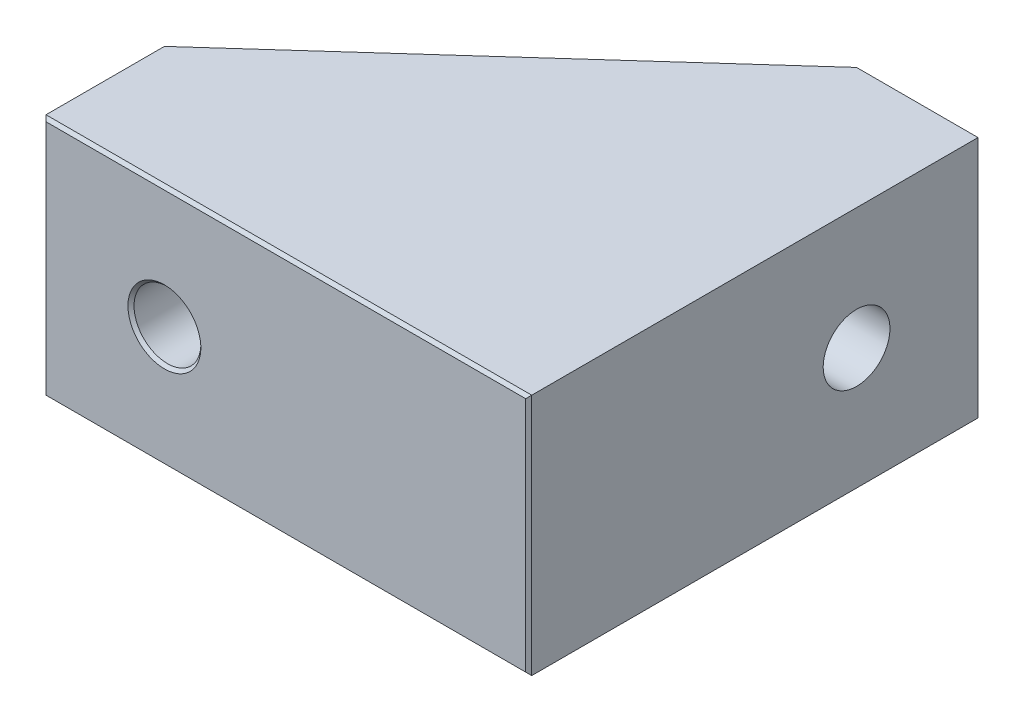
ISO-10303-21;
HEADER;
FILE_DESCRIPTION(('STEP AP214'),'2;1');
FILE_NAME('part.step','',(''),(''),'','','');
FILE_SCHEMA(('AUTOMOTIVE_DESIGN { 1 0 10303 214 1 1 1 1 }'));
ENDSEC;
DATA;
#1=APPLICATION_CONTEXT('core data for automotive mechanical design processes');
#2=APPLICATION_PROTOCOL_DEFINITION('international standard','automotive_design',2000,#1);
#3=PRODUCT_CONTEXT('',#1,'mechanical');
#4=PRODUCT('Part','Part','',(#3));
#5=PRODUCT_RELATED_PRODUCT_CATEGORY('part','',(#4));
#6=PRODUCT_DEFINITION_FORMATION('','',#4);
#7=PRODUCT_DEFINITION_CONTEXT('part definition',#1,'design');
#8=PRODUCT_DEFINITION('design','',#6,#7);
#9=PRODUCT_DEFINITION_SHAPE('','',#8);
#10=(LENGTH_UNIT() NAMED_UNIT(*) SI_UNIT(.MILLI.,.METRE.));
#11=(NAMED_UNIT(*) PLANE_ANGLE_UNIT() SI_UNIT($,.RADIAN.));
#12=(NAMED_UNIT(*) SI_UNIT($,.STERADIAN.) SOLID_ANGLE_UNIT());
#13=UNCERTAINTY_MEASURE_WITH_UNIT(LENGTH_MEASURE(1.E-05),#10,'distance_accuracy_value','');
#14=(GEOMETRIC_REPRESENTATION_CONTEXT(3) GLOBAL_UNCERTAINTY_ASSIGNED_CONTEXT((#13)) GLOBAL_UNIT_ASSIGNED_CONTEXT((#10,
#11,#12)) REPRESENTATION_CONTEXT('',''));
#15=CARTESIAN_POINT('',(0.,0.,0.));
#16=DIRECTION('',(0.,0.,1.));
#17=DIRECTION('',(1.,0.,0.));
#18=AXIS2_PLACEMENT_3D('',#15,#16,#17);
#19=CARTESIAN_POINT('',(-10.,20.,-37.));
#20=DIRECTION('',(1.,0.,0.));
#21=DIRECTION('',(0.,0.,-1.));
#22=AXIS2_PLACEMENT_3D('',#19,#20,#21);
#23=PLANE('',#22);
#24=CARTESIAN_POINT('',(-10.,10.,-27.));
#25=DIRECTION('',(1.,0.,0.));
#26=DIRECTION('',(0.,0.,-1.));
#27=AXIS2_PLACEMENT_3D('',#24,#25,#26);
#28=CIRCLE('',#27,3.00000000000001);
#29=CARTESIAN_POINT('',(-10.,10.,-30.));
#30=VERTEX_POINT('',#29);
#31=EDGE_CURVE('E52',#30,#30,#28,.T.);
#32=ORIENTED_EDGE('',*,*,#31,.T.);
#33=EDGE_LOOP('',(#32));
#34=FACE_BOUND('',#33,.T.);
#35=DIRECTION('',(0.,-1.,0.));
#36=VECTOR('',#35,1.);
#37=CARTESIAN_POINT('',(-9.99999999999999,20.,-10.));
#38=LINE('',#37,#36);
#39=CARTESIAN_POINT('',(-9.99999999999999,15.5,-10.));
#40=VERTEX_POINT('',#39);
#41=CARTESIAN_POINT('',(-9.99999999999999,4.5,-10.));
#42=VERTEX_POINT('',#41);
#43=EDGE_CURVE('E159',#40,#42,#38,.T.);
#44=ORIENTED_EDGE('',*,*,#43,.F.);
#45=DIRECTION('',(0.,0.,-1.));
#46=VECTOR('',#45,1.);
#47=CARTESIAN_POINT('',(-9.99999999999999,15.5,-10.));
#48=LINE('',#47,#46);
#49=CARTESIAN_POINT('',(-10.,15.5,-37.));
#50=VERTEX_POINT('',#49);
#51=EDGE_CURVE('E128',#40,#50,#48,.T.);
#52=ORIENTED_EDGE('',*,*,#51,.T.);
#53=DIRECTION('',(0.,-1.,0.));
#54=VECTOR('',#53,1.);
#55=CARTESIAN_POINT('',(-10.,20.,-37.));
#56=LINE('',#55,#54);
#57=CARTESIAN_POINT('',(-10.,4.5,-37.));
#58=VERTEX_POINT('',#57);
#59=EDGE_CURVE('E161',#50,#58,#56,.T.);
#60=ORIENTED_EDGE('',*,*,#59,.T.);
#61=DIRECTION('',(0.,0.,1.));
#62=VECTOR('',#61,1.);
#63=CARTESIAN_POINT('',(-9.99999999999999,4.5,-10.));
#64=LINE('',#63,#62);
#65=EDGE_CURVE('E241',#58,#42,#64,.T.);
#66=ORIENTED_EDGE('',*,*,#65,.T.);
#67=EDGE_LOOP('',(#44,#52,#60,#66));
#68=FACE_BOUND('',#67,.T.);
#69=ADVANCED_FACE('F41',(#34,#68),#23,.F.);
#70=CARTESIAN_POINT('',(-9.99999999999999,20.,-10.));
#71=DIRECTION('',(0.,0.,1.));
#72=DIRECTION('',(1.,0.,0.));
#73=AXIS2_PLACEMENT_3D('',#70,#71,#72);
#74=PLANE('',#73);
#75=CARTESIAN_POINT('',(-30.,10.,-10.));
#76=DIRECTION('',(0.,0.,1.));
#77=DIRECTION('',(1.,0.,0.));
#78=AXIS2_PLACEMENT_3D('',#75,#76,#77);
#79=CIRCLE('',#78,3.);
#80=CARTESIAN_POINT('',(-27.,10.,-10.));
#81=VERTEX_POINT('',#80);
#82=EDGE_CURVE('E11',#81,#81,#79,.T.);
#83=ORIENTED_EDGE('',*,*,#82,.T.);
#84=EDGE_LOOP('',(#83));
#85=FACE_BOUND('',#84,.T.);
#86=DIRECTION('',(0.,-1.,0.));
#87=VECTOR('',#86,1.);
#88=CARTESIAN_POINT('',(-40.,20.,-10.));
#89=LINE('',#88,#87);
#90=CARTESIAN_POINT('',(-40.,15.5,-10.));
#91=VERTEX_POINT('',#90);
#92=CARTESIAN_POINT('',(-40.,4.5,-10.));
#93=VERTEX_POINT('',#92);
#94=EDGE_CURVE('E146',#91,#93,#89,.T.);
#95=ORIENTED_EDGE('',*,*,#94,.F.);
#96=DIRECTION('',(1.,0.,0.));
#97=VECTOR('',#96,1.);
#98=CARTESIAN_POINT('',(-40.,15.5,-10.));
#99=LINE('',#98,#97);
#100=EDGE_CURVE('E123',#91,#40,#99,.T.);
#101=ORIENTED_EDGE('',*,*,#100,.T.);
#102=ORIENTED_EDGE('',*,*,#43,.T.);
#103=DIRECTION('',(-1.,0.,0.));
#104=VECTOR('',#103,1.);
#105=CARTESIAN_POINT('',(-40.,4.5,-10.));
#106=LINE('',#105,#104);
#107=EDGE_CURVE('E149',#42,#93,#106,.T.);
#108=ORIENTED_EDGE('',*,*,#107,.T.);
#109=EDGE_LOOP('',(#95,#101,#102,#108));
#110=FACE_BOUND('',#109,.T.);
#111=ADVANCED_FACE('F147',(#85,#110),#74,.F.);
#112=CARTESIAN_POINT('',(0.,20.,0.));
#113=DIRECTION('',(-1.,0.,0.));
#114=DIRECTION('',(0.,0.,1.));
#115=AXIS2_PLACEMENT_3D('',#112,#113,#114);
#116=PLANE('',#115);
#117=CARTESIAN_POINT('',(0.,10.,-27.));
#118=DIRECTION('',(-1.,0.,0.));
#119=DIRECTION('',(0.,0.,1.));
#120=AXIS2_PLACEMENT_3D('',#117,#118,#119);
#121=CIRCLE('',#120,2.75);
#122=CARTESIAN_POINT('',(0.,10.,-24.25));
#123=VERTEX_POINT('',#122);
#124=EDGE_CURVE('E255',#123,#123,#121,.T.);
#125=ORIENTED_EDGE('',*,*,#124,.T.);
#126=EDGE_LOOP('',(#125));
#127=FACE_BOUND('',#126,.T.);
#128=DIRECTION('',(0.,0.,-1.));
#129=VECTOR('',#128,1.);
#130=CARTESIAN_POINT('',(0.,20.,0.));
#131=LINE('',#130,#129);
#132=CARTESIAN_POINT('',(0.,20.,-0.25));
#133=VERTEX_POINT('',#132);
#134=CARTESIAN_POINT('',(0.,20.,-37.));
#135=VERTEX_POINT('',#134);
#136=EDGE_CURVE('E263',#133,#135,#131,.T.);
#137=ORIENTED_EDGE('',*,*,#136,.F.);
#138=DIRECTION('',(0.,-1.,0.));
#139=VECTOR('',#138,1.);
#140=CARTESIAN_POINT('',(0.,20.,-0.25));
#141=LINE('',#140,#139);
#142=CARTESIAN_POINT('',(0.,0.,-0.25));
#143=VERTEX_POINT('',#142);
#144=EDGE_CURVE('E60',#133,#143,#141,.T.);
#145=ORIENTED_EDGE('',*,*,#144,.T.);
#146=DIRECTION('',(0.,0.,-1.));
#147=VECTOR('',#146,1.);
#148=CARTESIAN_POINT('',(0.,0.,0.));
#149=LINE('',#148,#147);
#150=CARTESIAN_POINT('',(0.,0.,-37.));
#151=VERTEX_POINT('',#150);
#152=EDGE_CURVE('E262',#143,#151,#149,.T.);
#153=ORIENTED_EDGE('',*,*,#152,.T.);
#154=DIRECTION('',(0.,-1.,0.));
#155=VECTOR('',#154,1.);
#156=CARTESIAN_POINT('',(0.,20.,-37.));
#157=LINE('',#156,#155);
#158=EDGE_CURVE('E169',#135,#151,#157,.T.);
#159=ORIENTED_EDGE('',*,*,#158,.F.);
#160=EDGE_LOOP('',(#137,#145,#153,#159));
#161=FACE_BOUND('',#160,.T.);
#162=ADVANCED_FACE('F310',(#127,#161),#116,.F.);
#163=CARTESIAN_POINT('',(0.,20.,-37.));
#164=DIRECTION('',(0.,0.,1.));
#165=DIRECTION('',(1.,0.,0.));
#166=AXIS2_PLACEMENT_3D('',#163,#164,#165);
#167=PLANE('',#166);
#168=DIRECTION('',(-1.,0.,0.));
#169=VECTOR('',#168,1.);
#170=CARTESIAN_POINT('',(0.,0.,-37.));
#171=LINE('',#170,#169);
#172=CARTESIAN_POINT('',(-10.,0.,-37.));
#173=VERTEX_POINT('',#172);
#174=EDGE_CURVE('E272',#151,#173,#171,.T.);
#175=ORIENTED_EDGE('',*,*,#174,.T.);
#176=DIRECTION('',(0.,-1.,0.));
#177=VECTOR('',#176,1.);
#178=CARTESIAN_POINT('',(-10.,4.5,-37.));
#179=LINE('',#178,#177);
#180=EDGE_CURVE('E248',#58,#173,#179,.T.);
#181=ORIENTED_EDGE('',*,*,#180,.F.);
#182=ORIENTED_EDGE('',*,*,#59,.F.);
#183=CARTESIAN_POINT('',(-10.,20.,-37.));
#184=VERTEX_POINT('',#183);
#185=EDGE_CURVE('E141',#184,#50,#56,.T.);
#186=ORIENTED_EDGE('',*,*,#185,.F.);
#187=DIRECTION('',(-1.,0.,0.));
#188=VECTOR('',#187,1.);
#189=CARTESIAN_POINT('',(0.,20.,-37.));
#190=LINE('',#189,#188);
#191=EDGE_CURVE('E266',#135,#184,#190,.T.);
#192=ORIENTED_EDGE('',*,*,#191,.F.);
#193=ORIENTED_EDGE('',*,*,#158,.T.);
#194=EDGE_LOOP('',(#175,#181,#182,#186,#192,#193));
#195=FACE_BOUND('',#194,.T.);
#196=ADVANCED_FACE('F316',(#195),#167,.F.);
#197=CARTESIAN_POINT('',(-40.,20.,-10.));
#198=DIRECTION('',(1.,0.,0.));
#199=DIRECTION('',(0.,0.,-1.));
#200=AXIS2_PLACEMENT_3D('',#197,#198,#199);
#201=PLANE('',#200);
#202=DIRECTION('',(0.,0.,1.));
#203=VECTOR('',#202,1.);
#204=CARTESIAN_POINT('',(-40.,0.,-10.));
#205=LINE('',#204,#203);
#206=CARTESIAN_POINT('',(-40.,0.,-10.));
#207=VERTEX_POINT('',#206);
#208=CARTESIAN_POINT('',(-40.,0.,-0.25));
#209=VERTEX_POINT('',#208);
#210=EDGE_CURVE('E164',#207,#209,#205,.T.);
#211=ORIENTED_EDGE('',*,*,#210,.T.);
#212=DIRECTION('',(0.,1.,0.));
#213=VECTOR('',#212,1.);
#214=CARTESIAN_POINT('',(-40.,20.,-0.25));
#215=LINE('',#214,#213);
#216=CARTESIAN_POINT('',(-40.,20.,-0.25));
#217=VERTEX_POINT('',#216);
#218=EDGE_CURVE('E190',#209,#217,#215,.T.);
#219=ORIENTED_EDGE('',*,*,#218,.T.);
#220=DIRECTION('',(0.,0.,1.));
#221=VECTOR('',#220,1.);
#222=CARTESIAN_POINT('',(-40.,20.,-10.));
#223=LINE('',#222,#221);
#224=CARTESIAN_POINT('',(-40.,20.,-10.));
#225=VERTEX_POINT('',#224);
#226=EDGE_CURVE('E153',#225,#217,#223,.T.);
#227=ORIENTED_EDGE('',*,*,#226,.F.);
#228=EDGE_CURVE('E138',#225,#91,#89,.T.);
#229=ORIENTED_EDGE('',*,*,#228,.T.);
#230=ORIENTED_EDGE('',*,*,#94,.T.);
#231=DIRECTION('',(0.,-1.,0.));
#232=VECTOR('',#231,1.);
#233=CARTESIAN_POINT('',(-40.,4.5,-10.));
#234=LINE('',#233,#232);
#235=EDGE_CURVE('E252',#93,#207,#234,.T.);
#236=ORIENTED_EDGE('',*,*,#235,.T.);
#237=EDGE_LOOP('',(#211,#219,#227,#229,#230,#236));
#238=FACE_BOUND('',#237,.T.);
#239=ADVANCED_FACE('F156',(#238),#201,.F.);
#240=CARTESIAN_POINT('',(-40.,20.,0.));
#241=DIRECTION('',(0.,0.,-1.));
#242=DIRECTION('',(-1.,0.,0.));
#243=AXIS2_PLACEMENT_3D('',#240,#241,#242);
#244=PLANE('',#243);
#245=DIRECTION('',(-1.,0.,0.));
#246=VECTOR('',#245,1.);
#247=CARTESIAN_POINT('',(-40.,19.75,0.));
#248=LINE('',#247,#246);
#249=CARTESIAN_POINT('',(-0.25,19.75,0.));
#250=VERTEX_POINT('',#249);
#251=CARTESIAN_POINT('',(-39.75,19.75,0.));
#252=VERTEX_POINT('',#251);
#253=EDGE_CURVE('E183',#250,#252,#248,.T.);
#254=ORIENTED_EDGE('',*,*,#253,.T.);
#255=DIRECTION('',(0.,-1.,0.));
#256=VECTOR('',#255,1.);
#257=CARTESIAN_POINT('',(-39.75,20.,0.));
#258=LINE('',#257,#256);
#259=CARTESIAN_POINT('',(-39.75,0.25,0.));
#260=VERTEX_POINT('',#259);
#261=EDGE_CURVE('E186',#252,#260,#258,.T.);
#262=ORIENTED_EDGE('',*,*,#261,.T.);
#263=DIRECTION('',(1.,0.,0.));
#264=VECTOR('',#263,1.);
#265=CARTESIAN_POINT('',(-40.,0.25,0.));
#266=LINE('',#265,#264);
#267=CARTESIAN_POINT('',(-0.25,0.25,0.));
#268=VERTEX_POINT('',#267);
#269=EDGE_CURVE('E177',#260,#268,#266,.T.);
#270=ORIENTED_EDGE('',*,*,#269,.T.);
#271=DIRECTION('',(0.,1.,0.));
#272=VECTOR('',#271,1.);
#273=CARTESIAN_POINT('',(-0.25,20.,0.));
#274=LINE('',#273,#272);
#275=EDGE_CURVE('E180',#268,#250,#274,.T.);
#276=ORIENTED_EDGE('',*,*,#275,.T.);
#277=EDGE_LOOP('',(#254,#262,#270,#276));
#278=FACE_BOUND('',#277,.T.);
#279=CARTESIAN_POINT('',(-30.,10.,0.));
#280=DIRECTION('',(0.,0.,-1.));
#281=DIRECTION('',(-1.,0.,0.));
#282=AXIS2_PLACEMENT_3D('',#279,#280,#281);
#283=CIRCLE('',#282,2.99999999999996);
#284=CARTESIAN_POINT('',(-33.,10.,0.));
#285=VERTEX_POINT('',#284);
#286=EDGE_CURVE('E173',#285,#285,#283,.T.);
#287=ORIENTED_EDGE('',*,*,#286,.T.);
#288=EDGE_LOOP('',(#287));
#289=FACE_BOUND('',#288,.T.);
#290=ADVANCED_FACE('F290',(#278,#289),#244,.F.);
#291=CARTESIAN_POINT('',(0.,20.,0.));
#292=DIRECTION('',(0.,1.,0.));
#293=DIRECTION('',(0.,0.,1.));
#294=AXIS2_PLACEMENT_3D('',#291,#292,#293);
#295=PLANE('',#294);
#296=ORIENTED_EDGE('',*,*,#226,.T.);
#297=DIRECTION('',(1.,0.,0.));
#298=VECTOR('',#297,1.);
#299=CARTESIAN_POINT('',(0.,20.,-0.25));
#300=LINE('',#299,#298);
#301=EDGE_CURVE('E68',#217,#133,#300,.T.);
#302=ORIENTED_EDGE('',*,*,#301,.T.);
#303=ORIENTED_EDGE('',*,*,#136,.T.);
#304=ORIENTED_EDGE('',*,*,#191,.T.);
#305=DIRECTION('',(-0.743294146247166,0.,0.66896473162245));
#306=VECTOR('',#305,1.);
#307=CARTESIAN_POINT('',(-10.,20.,-37.));
#308=LINE('',#307,#306);
#309=EDGE_CURVE('E143',#184,#225,#308,.T.);
#310=ORIENTED_EDGE('',*,*,#309,.T.);
#311=EDGE_LOOP('',(#296,#302,#303,#304,#310));
#312=FACE_BOUND('',#311,.T.);
#313=ADVANCED_FACE('F364',(#312),#295,.T.);
#314=CARTESIAN_POINT('',(0.,0.,0.));
#315=DIRECTION('',(0.,1.,0.));
#316=DIRECTION('',(0.,0.,1.));
#317=AXIS2_PLACEMENT_3D('',#314,#315,#316);
#318=PLANE('',#317);
#319=ORIENTED_EDGE('',*,*,#152,.F.);
#320=DIRECTION('',(-1.,0.,0.));
#321=VECTOR('',#320,1.);
#322=CARTESIAN_POINT('',(0.,0.,-0.25));
#323=LINE('',#322,#321);
#324=EDGE_CURVE('E197',#143,#209,#323,.T.);
#325=ORIENTED_EDGE('',*,*,#324,.T.);
#326=ORIENTED_EDGE('',*,*,#210,.F.);
#327=DIRECTION('',(0.743294146247166,0.,-0.66896473162245));
#328=VECTOR('',#327,1.);
#329=CARTESIAN_POINT('',(-10.,0.,-37.));
#330=LINE('',#329,#328);
#331=EDGE_CURVE('E242',#207,#173,#330,.T.);
#332=ORIENTED_EDGE('',*,*,#331,.T.);
#333=ORIENTED_EDGE('',*,*,#174,.F.);
#334=EDGE_LOOP('',(#319,#325,#326,#332,#333));
#335=FACE_BOUND('',#334,.T.);
#336=ADVANCED_FACE('F359',(#335),#318,.F.);
#337=CARTESIAN_POINT('',(10.,10.,-27.));
#338=DIRECTION('',(-1.,0.,0.));
#339=DIRECTION('',(0.,0.,1.));
#340=AXIS2_PLACEMENT_3D('',#337,#338,#339);
#341=CYLINDRICAL_SURFACE('',#340,2.75);
#342=CARTESIAN_POINT('',(-9.74999999999999,10.,-27.));
#343=DIRECTION('',(1.,0.,0.));
#344=DIRECTION('',(0.,0.,-1.));
#345=AXIS2_PLACEMENT_3D('',#342,#343,#344);
#346=CIRCLE('',#345,2.75);
#347=CARTESIAN_POINT('',(-9.74999999999999,10.,-29.75));
#348=VERTEX_POINT('',#347);
#349=EDGE_CURVE('E208',#348,#348,#346,.F.);
#350=ORIENTED_EDGE('',*,*,#349,.T.);
#351=EDGE_LOOP('',(#350));
#352=FACE_BOUND('',#351,.T.);
#353=ORIENTED_EDGE('',*,*,#124,.F.);
#354=EDGE_LOOP('',(#353));
#355=FACE_BOUND('',#354,.T.);
#356=ADVANCED_FACE('F355',(#352,#355),#341,.F.);
#357=CARTESIAN_POINT('',(-30.,10.,10.));
#358=DIRECTION('',(0.,0.,-1.));
#359=DIRECTION('',(-1.,0.,0.));
#360=AXIS2_PLACEMENT_3D('',#357,#358,#359);
#361=CYLINDRICAL_SURFACE('',#360,2.74999999999999);
#362=CARTESIAN_POINT('',(-30.,10.,-0.250000000000009));
#363=DIRECTION('',(0.,0.,-1.));
#364=DIRECTION('',(-1.,0.,0.));
#365=AXIS2_PLACEMENT_3D('',#362,#363,#364);
#366=CIRCLE('',#365,2.74999999999999);
#367=CARTESIAN_POINT('',(-32.75,10.,-0.249999999999971));
#368=VERTEX_POINT('',#367);
#369=EDGE_CURVE('E204',#368,#368,#366,.F.);
#370=ORIENTED_EDGE('',*,*,#369,.T.);
#371=EDGE_LOOP('',(#370));
#372=FACE_BOUND('',#371,.T.);
#373=CARTESIAN_POINT('',(-30.,10.,-9.74999999999999));
#374=DIRECTION('',(0.,0.,1.));
#375=DIRECTION('',(1.,0.,0.));
#376=AXIS2_PLACEMENT_3D('',#373,#374,#375);
#377=CIRCLE('',#376,2.74999999999999);
#378=CARTESIAN_POINT('',(-27.25,10.,-9.74999999999999));
#379=VERTEX_POINT('',#378);
#380=EDGE_CURVE('E200',#379,#379,#377,.F.);
#381=ORIENTED_EDGE('',*,*,#380,.T.);
#382=EDGE_LOOP('',(#381));
#383=FACE_BOUND('',#382,.T.);
#384=ADVANCED_FACE('F358',(#372,#383),#361,.F.);
#385=CARTESIAN_POINT('',(-10.,4.5,-37.));
#386=DIRECTION('',(-0.66896473162245,0.,-0.743294146247166));
#387=DIRECTION('',(-0.743294146247166,0.,0.66896473162245));
#388=AXIS2_PLACEMENT_3D('',#385,#386,#387);
#389=PLANE('',#388);
#390=ORIENTED_EDGE('',*,*,#331,.F.);
#391=ORIENTED_EDGE('',*,*,#235,.F.);
#392=DIRECTION('',(0.743294146247166,0.,-0.66896473162245));
#393=VECTOR('',#392,1.);
#394=CARTESIAN_POINT('',(-10.,4.5,-37.));
#395=LINE('',#394,#393);
#396=EDGE_CURVE('E237',#93,#58,#395,.T.);
#397=ORIENTED_EDGE('',*,*,#396,.T.);
#398=ORIENTED_EDGE('',*,*,#180,.T.);
#399=EDGE_LOOP('',(#390,#391,#397,#398));
#400=FACE_BOUND('',#399,.T.);
#401=ADVANCED_FACE('F373',(#400),#389,.T.);
#402=CARTESIAN_POINT('',(0.,4.5,0.));
#403=DIRECTION('',(0.,-1.,0.));
#404=DIRECTION('',(0.,0.,-1.));
#405=AXIS2_PLACEMENT_3D('',#402,#403,#404);
#406=PLANE('',#405);
#407=ORIENTED_EDGE('',*,*,#396,.F.);
#408=ORIENTED_EDGE('',*,*,#107,.F.);
#409=ORIENTED_EDGE('',*,*,#65,.F.);
#410=EDGE_LOOP('',(#407,#408,#409));
#411=FACE_BOUND('',#410,.T.);
#412=ADVANCED_FACE('F371',(#411),#406,.F.);
#413=CARTESIAN_POINT('',(-10.,15.5,-37.));
#414=DIRECTION('',(-0.66896473162245,0.,-0.743294146247166));
#415=DIRECTION('',(-0.743294146247166,0.,0.66896473162245));
#416=AXIS2_PLACEMENT_3D('',#413,#414,#415);
#417=PLANE('',#416);
#418=ORIENTED_EDGE('',*,*,#309,.F.);
#419=ORIENTED_EDGE('',*,*,#185,.T.);
#420=DIRECTION('',(-0.743294146247166,0.,0.66896473162245));
#421=VECTOR('',#420,1.);
#422=CARTESIAN_POINT('',(-10.,15.5,-37.));
#423=LINE('',#422,#421);
#424=EDGE_CURVE('E126',#50,#91,#423,.T.);
#425=ORIENTED_EDGE('',*,*,#424,.T.);
#426=ORIENTED_EDGE('',*,*,#228,.F.);
#427=EDGE_LOOP('',(#418,#419,#425,#426));
#428=FACE_BOUND('',#427,.T.);
#429=ADVANCED_FACE('F136',(#428),#417,.T.);
#430=CARTESIAN_POINT('',(0.,15.5,0.));
#431=DIRECTION('',(0.,-1.,0.));
#432=DIRECTION('',(0.,0.,-1.));
#433=AXIS2_PLACEMENT_3D('',#430,#431,#432);
#434=PLANE('',#433);
#435=ORIENTED_EDGE('',*,*,#424,.F.);
#436=ORIENTED_EDGE('',*,*,#51,.F.);
#437=ORIENTED_EDGE('',*,*,#100,.F.);
#438=EDGE_LOOP('',(#435,#436,#437));
#439=FACE_BOUND('',#438,.T.);
#440=ADVANCED_FACE('F125',(#439),#434,.T.);
#441=CARTESIAN_POINT('',(0.,20.,-0.25));
#442=DIRECTION('',(-0.707106781186547,0.,-0.707106781186547));
#443=DIRECTION('',(0.,-1.,0.));
#444=AXIS2_PLACEMENT_3D('',#441,#442,#443);
#445=PLANE('',#444);
#446=DIRECTION('',(-0.577350269189626,0.577350269189626,0.577350269189626));
#447=VECTOR('',#446,1.);
#448=CARTESIAN_POINT('',(-13.5,13.5,13.25));
#449=LINE('',#448,#447);
#450=EDGE_CURVE('E220',#143,#268,#449,.T.);
#451=ORIENTED_EDGE('',*,*,#450,.F.);
#452=ORIENTED_EDGE('',*,*,#144,.F.);
#453=DIRECTION('',(0.577350269189626,0.577350269189626,-0.577350269189626));
#454=VECTOR('',#453,1.);
#455=CARTESIAN_POINT('',(0.,20.,-0.25));
#456=LINE('',#455,#454);
#457=EDGE_CURVE('E46',#250,#133,#456,.T.);
#458=ORIENTED_EDGE('',*,*,#457,.F.);
#459=ORIENTED_EDGE('',*,*,#275,.F.);
#460=EDGE_LOOP('',(#451,#452,#458,#459));
#461=FACE_BOUND('',#460,.T.);
#462=ADVANCED_FACE('F294',(#461),#445,.F.);
#463=CARTESIAN_POINT('',(0.,20.,-0.25));
#464=DIRECTION('',(0.,0.707106781186547,0.707106781186547));
#465=DIRECTION('',(-1.,0.,0.));
#466=AXIS2_PLACEMENT_3D('',#463,#464,#465);
#467=PLANE('',#466);
#468=ORIENTED_EDGE('',*,*,#457,.T.);
#469=ORIENTED_EDGE('',*,*,#301,.F.);
#470=DIRECTION('',(-0.577350269189626,0.577350269189626,-0.577350269189626));
#471=VECTOR('',#470,1.);
#472=CARTESIAN_POINT('',(-26.6666666666667,6.66666666666667,13.0833333333333));
#473=LINE('',#472,#471);
#474=EDGE_CURVE('E218',#252,#217,#473,.T.);
#475=ORIENTED_EDGE('',*,*,#474,.F.);
#476=ORIENTED_EDGE('',*,*,#253,.F.);
#477=EDGE_LOOP('',(#468,#469,#475,#476));
#478=FACE_BOUND('',#477,.T.);
#479=ADVANCED_FACE('F292',(#478),#467,.T.);
#480=CARTESIAN_POINT('',(-40.,0.25,0.));
#481=DIRECTION('',(0.,0.707106781186547,-0.707106781186547));
#482=DIRECTION('',(1.,0.,0.));
#483=AXIS2_PLACEMENT_3D('',#480,#481,#482);
#484=PLANE('',#483);
#485=ORIENTED_EDGE('',*,*,#450,.T.);
#486=ORIENTED_EDGE('',*,*,#269,.F.);
#487=DIRECTION('',(-0.577350269189626,-0.577350269189626,-0.577350269189626));
#488=VECTOR('',#487,1.);
#489=CARTESIAN_POINT('',(-39.8333333333333,0.166666666666667,-0.0833333333333334));
#490=LINE('',#489,#488);
#491=EDGE_CURVE('E215',#209,#260,#490,.F.);
#492=ORIENTED_EDGE('',*,*,#491,.F.);
#493=ORIENTED_EDGE('',*,*,#324,.F.);
#494=EDGE_LOOP('',(#485,#486,#492,#493));
#495=FACE_BOUND('',#494,.T.);
#496=ADVANCED_FACE('F287',(#495),#484,.F.);
#497=CARTESIAN_POINT('',(-39.75,20.,0.));
#498=DIRECTION('',(0.707106781186547,0.,-0.707106781186547));
#499=DIRECTION('',(0.,-1.,0.));
#500=AXIS2_PLACEMENT_3D('',#497,#498,#499);
#501=PLANE('',#500);
#502=ORIENTED_EDGE('',*,*,#474,.T.);
#503=ORIENTED_EDGE('',*,*,#218,.F.);
#504=ORIENTED_EDGE('',*,*,#491,.T.);
#505=ORIENTED_EDGE('',*,*,#261,.F.);
#506=EDGE_LOOP('',(#502,#503,#504,#505));
#507=FACE_BOUND('',#506,.T.);
#508=ADVANCED_FACE('F284',(#507),#501,.F.);
#509=CARTESIAN_POINT('',(-30.,10.,0.));
#510=DIRECTION('',(0.,0.,1.));
#511=DIRECTION('',(1.,0.,0.));
#512=AXIS2_PLACEMENT_3D('',#509,#510,#511);
#513=CONICAL_SURFACE('',#512,3.,0.785398163397454);
#514=ORIENTED_EDGE('',*,*,#369,.F.);
#515=EDGE_LOOP('',(#514));
#516=FACE_BOUND('',#515,.T.);
#517=ORIENTED_EDGE('',*,*,#286,.F.);
#518=EDGE_LOOP('',(#517));
#519=FACE_BOUND('',#518,.T.);
#520=ADVANCED_FACE('F328',(#516,#519),#513,.F.);
#521=CARTESIAN_POINT('',(-9.74999999999999,10.,-27.));
#522=DIRECTION('',(-1.,0.,0.));
#523=DIRECTION('',(0.,0.,1.));
#524=AXIS2_PLACEMENT_3D('',#521,#522,#523);
#525=CONICAL_SURFACE('',#524,2.75,0.785398163397455);
#526=ORIENTED_EDGE('',*,*,#31,.F.);
#527=EDGE_LOOP('',(#526));
#528=FACE_BOUND('',#527,.T.);
#529=ORIENTED_EDGE('',*,*,#349,.F.);
#530=EDGE_LOOP('',(#529));
#531=FACE_BOUND('',#530,.T.);
#532=ADVANCED_FACE('F341',(#528,#531),#525,.F.);
#533=CARTESIAN_POINT('',(-30.,10.,-9.74999999999999));
#534=DIRECTION('',(0.,0.,-1.));
#535=DIRECTION('',(-1.,0.,0.));
#536=AXIS2_PLACEMENT_3D('',#533,#534,#535);
#537=CONICAL_SURFACE('',#536,2.74999999999999,0.78539816339745);
#538=ORIENTED_EDGE('',*,*,#82,.F.);
#539=EDGE_LOOP('',(#538));
#540=FACE_BOUND('',#539,.T.);
#541=ORIENTED_EDGE('',*,*,#380,.F.);
#542=EDGE_LOOP('',(#541));
#543=FACE_BOUND('',#542,.T.);
#544=ADVANCED_FACE('F44',(#540,#543),#537,.F.);
#545=CLOSED_SHELL('',(#69,#111,#162,#196,#239,#290,#313,#336,#356,#384,#401,#412,#429,#440,#462,
#479,#496,#508,#520,#532,#544));
#546=MANIFOLD_SOLID_BREP('B2',#545);
#547=ADVANCED_BREP_SHAPE_REPRESENTATION('',(#18,#546),#14);
#548=SHAPE_DEFINITION_REPRESENTATION(#9,#547);
ENDSEC;
END-ISO-10303-21;
